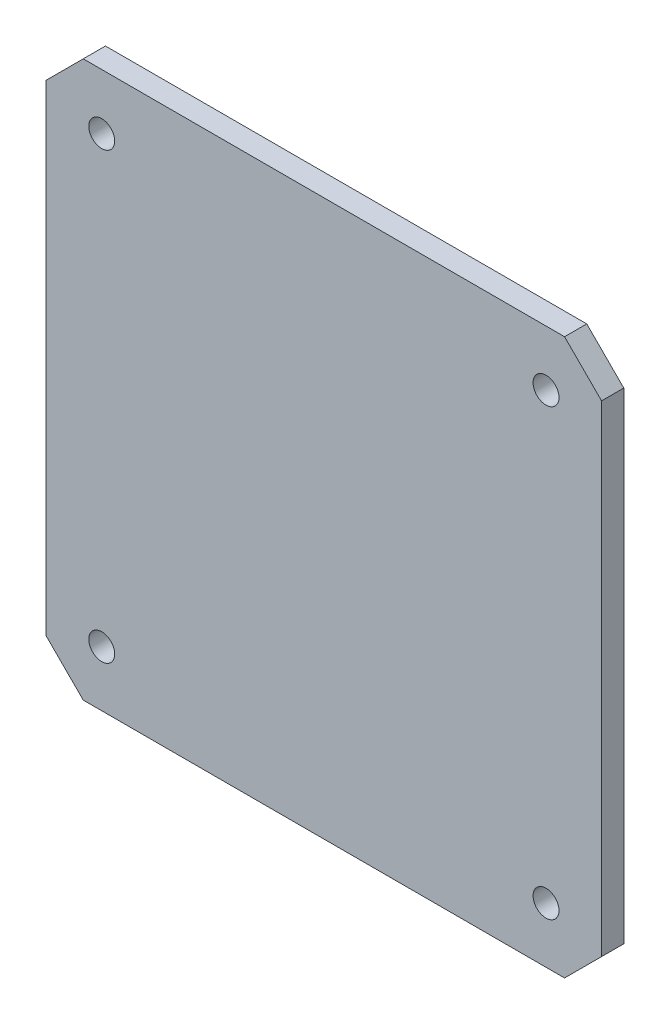
ISO-10303-21;
HEADER;
FILE_DESCRIPTION(('STEP AP214'),'2;1');
FILE_NAME('part.step','',(''),(''),'','','');
FILE_SCHEMA(('AUTOMOTIVE_DESIGN { 1 0 10303 214 1 1 1 1 }'));
ENDSEC;
DATA;
#1=APPLICATION_CONTEXT('core data for automotive mechanical design processes');
#2=APPLICATION_PROTOCOL_DEFINITION('international standard','automotive_design',2000,#1);
#3=PRODUCT_CONTEXT('',#1,'mechanical');
#4=PRODUCT('Part','Part','',(#3));
#5=PRODUCT_RELATED_PRODUCT_CATEGORY('part','',(#4));
#6=PRODUCT_DEFINITION_FORMATION('','',#4);
#7=PRODUCT_DEFINITION_CONTEXT('part definition',#1,'design');
#8=PRODUCT_DEFINITION('design','',#6,#7);
#9=PRODUCT_DEFINITION_SHAPE('','',#8);
#10=(LENGTH_UNIT() NAMED_UNIT(*) SI_UNIT(.MILLI.,.METRE.));
#11=(NAMED_UNIT(*) PLANE_ANGLE_UNIT() SI_UNIT($,.RADIAN.));
#12=(NAMED_UNIT(*) SI_UNIT($,.STERADIAN.) SOLID_ANGLE_UNIT());
#13=UNCERTAINTY_MEASURE_WITH_UNIT(LENGTH_MEASURE(1.E-05),#10,'distance_accuracy_value','');
#14=(GEOMETRIC_REPRESENTATION_CONTEXT(3) GLOBAL_UNCERTAINTY_ASSIGNED_CONTEXT((#13)) GLOBAL_UNIT_ASSIGNED_CONTEXT((#10,
#11,#12)) REPRESENTATION_CONTEXT('',''));
#15=CARTESIAN_POINT('',(0.,0.,0.));
#16=DIRECTION('',(0.,0.,1.));
#17=DIRECTION('',(1.,0.,0.));
#18=AXIS2_PLACEMENT_3D('',#15,#16,#17);
#19=CARTESIAN_POINT('',(-75.,75.,-6.));
#20=DIRECTION('',(-1.,0.,0.));
#21=DIRECTION('',(0.,-1.,0.));
#22=AXIS2_PLACEMENT_3D('',#19,#20,#21);
#23=PLANE('',#22);
#24=DIRECTION('',(0.,-1.,0.));
#25=VECTOR('',#24,1.);
#26=CARTESIAN_POINT('',(-75.,75.,-6.));
#27=LINE('',#26,#25);
#28=CARTESIAN_POINT('',(-75.,65.,-6.));
#29=VERTEX_POINT('',#28);
#30=CARTESIAN_POINT('',(-75.,-65.,-6.));
#31=VERTEX_POINT('',#30);
#32=EDGE_CURVE('E137',#29,#31,#27,.T.);
#33=ORIENTED_EDGE('',*,*,#32,.T.);
#34=DIRECTION('',(0.,0.,1.));
#35=VECTOR('',#34,1.);
#36=CARTESIAN_POINT('',(-75.,-65.,-6.));
#37=LINE('',#36,#35);
#38=CARTESIAN_POINT('',(-75.,-65.,0.));
#39=VERTEX_POINT('',#38);
#40=EDGE_CURVE('E179',#31,#39,#37,.T.);
#41=ORIENTED_EDGE('',*,*,#40,.T.);
#42=DIRECTION('',(0.,-1.,0.));
#43=VECTOR('',#42,1.);
#44=CARTESIAN_POINT('',(-75.,75.,0.));
#45=LINE('',#44,#43);
#46=CARTESIAN_POINT('',(-75.,65.,0.));
#47=VERTEX_POINT('',#46);
#48=EDGE_CURVE('E185',#47,#39,#45,.T.);
#49=ORIENTED_EDGE('',*,*,#48,.F.);
#50=DIRECTION('',(0.,0.,-1.));
#51=VECTOR('',#50,1.);
#52=CARTESIAN_POINT('',(-75.,65.,-6.));
#53=LINE('',#52,#51);
#54=EDGE_CURVE('E146',#47,#29,#53,.T.);
#55=ORIENTED_EDGE('',*,*,#54,.T.);
#56=EDGE_LOOP('',(#33,#41,#49,#55));
#57=FACE_BOUND('',#56,.T.);
#58=ADVANCED_FACE('F66',(#57),#23,.T.);
#59=CARTESIAN_POINT('',(75.,75.,-6.));
#60=DIRECTION('',(0.,1.,0.));
#61=DIRECTION('',(-1.,0.,0.));
#62=AXIS2_PLACEMENT_3D('',#59,#60,#61);
#63=PLANE('',#62);
#64=DIRECTION('',(-1.,0.,0.));
#65=VECTOR('',#64,1.);
#66=CARTESIAN_POINT('',(75.,75.,0.));
#67=LINE('',#66,#65);
#68=CARTESIAN_POINT('',(65.,75.,0.));
#69=VERTEX_POINT('',#68);
#70=CARTESIAN_POINT('',(-65.,75.,0.));
#71=VERTEX_POINT('',#70);
#72=EDGE_CURVE('E127',#69,#71,#67,.T.);
#73=ORIENTED_EDGE('',*,*,#72,.F.);
#74=DIRECTION('',(0.,0.,-1.));
#75=VECTOR('',#74,1.);
#76=CARTESIAN_POINT('',(65.,75.,-6.));
#77=LINE('',#76,#75);
#78=CARTESIAN_POINT('',(65.,75.,-6.));
#79=VERTEX_POINT('',#78);
#80=EDGE_CURVE('E164',#69,#79,#77,.T.);
#81=ORIENTED_EDGE('',*,*,#80,.T.);
#82=DIRECTION('',(-1.,0.,0.));
#83=VECTOR('',#82,1.);
#84=CARTESIAN_POINT('',(75.,75.,-6.));
#85=LINE('',#84,#83);
#86=CARTESIAN_POINT('',(-65.,75.,-6.));
#87=VERTEX_POINT('',#86);
#88=EDGE_CURVE('E150',#79,#87,#85,.T.);
#89=ORIENTED_EDGE('',*,*,#88,.T.);
#90=DIRECTION('',(0.,0.,1.));
#91=VECTOR('',#90,1.);
#92=CARTESIAN_POINT('',(-65.,75.,-6.));
#93=LINE('',#92,#91);
#94=EDGE_CURVE('E145',#87,#71,#93,.T.);
#95=ORIENTED_EDGE('',*,*,#94,.T.);
#96=EDGE_LOOP('',(#73,#81,#89,#95));
#97=FACE_BOUND('',#96,.T.);
#98=ADVANCED_FACE('F148',(#97),#63,.T.);
#99=CARTESIAN_POINT('',(75.,75.,-6.));
#100=DIRECTION('',(1.,0.,0.));
#101=DIRECTION('',(0.,1.,0.));
#102=AXIS2_PLACEMENT_3D('',#99,#100,#101);
#103=PLANE('',#102);
#104=DIRECTION('',(0.,1.,0.));
#105=VECTOR('',#104,1.);
#106=CARTESIAN_POINT('',(75.,75.,0.));
#107=LINE('',#106,#105);
#108=CARTESIAN_POINT('',(75.,-65.,0.));
#109=VERTEX_POINT('',#108);
#110=CARTESIAN_POINT('',(75.,65.,0.));
#111=VERTEX_POINT('',#110);
#112=EDGE_CURVE('E138',#109,#111,#107,.T.);
#113=ORIENTED_EDGE('',*,*,#112,.F.);
#114=DIRECTION('',(0.,0.,-1.));
#115=VECTOR('',#114,1.);
#116=CARTESIAN_POINT('',(75.,-65.,-6.));
#117=LINE('',#116,#115);
#118=CARTESIAN_POINT('',(75.,-65.,-6.));
#119=VERTEX_POINT('',#118);
#120=EDGE_CURVE('E174',#109,#119,#117,.T.);
#121=ORIENTED_EDGE('',*,*,#120,.T.);
#122=DIRECTION('',(0.,1.,0.));
#123=VECTOR('',#122,1.);
#124=CARTESIAN_POINT('',(75.,75.,-6.));
#125=LINE('',#124,#123);
#126=CARTESIAN_POINT('',(75.,65.,-6.));
#127=VERTEX_POINT('',#126);
#128=EDGE_CURVE('E153',#119,#127,#125,.T.);
#129=ORIENTED_EDGE('',*,*,#128,.T.);
#130=DIRECTION('',(0.,0.,1.));
#131=VECTOR('',#130,1.);
#132=CARTESIAN_POINT('',(75.,65.,-6.));
#133=LINE('',#132,#131);
#134=EDGE_CURVE('E160',#127,#111,#133,.T.);
#135=ORIENTED_EDGE('',*,*,#134,.T.);
#136=EDGE_LOOP('',(#113,#121,#129,#135));
#137=FACE_BOUND('',#136,.T.);
#138=ADVANCED_FACE('F205',(#137),#103,.T.);
#139=CARTESIAN_POINT('',(75.,-75.,-6.));
#140=DIRECTION('',(0.,-1.,0.));
#141=DIRECTION('',(1.,0.,0.));
#142=AXIS2_PLACEMENT_3D('',#139,#140,#141);
#143=PLANE('',#142);
#144=DIRECTION('',(1.,0.,0.));
#145=VECTOR('',#144,1.);
#146=CARTESIAN_POINT('',(75.,-75.,0.));
#147=LINE('',#146,#145);
#148=CARTESIAN_POINT('',(-65.,-75.,0.));
#149=VERTEX_POINT('',#148);
#150=CARTESIAN_POINT('',(65.,-75.,0.));
#151=VERTEX_POINT('',#150);
#152=EDGE_CURVE('E189',#149,#151,#147,.T.);
#153=ORIENTED_EDGE('',*,*,#152,.F.);
#154=DIRECTION('',(0.,0.,-1.));
#155=VECTOR('',#154,1.);
#156=CARTESIAN_POINT('',(-65.,-75.,-6.));
#157=LINE('',#156,#155);
#158=CARTESIAN_POINT('',(-65.,-75.,-6.));
#159=VERTEX_POINT('',#158);
#160=EDGE_CURVE('E74',#149,#159,#157,.T.);
#161=ORIENTED_EDGE('',*,*,#160,.T.);
#162=DIRECTION('',(1.,0.,0.));
#163=VECTOR('',#162,1.);
#164=CARTESIAN_POINT('',(75.,-75.,-6.));
#165=LINE('',#164,#163);
#166=CARTESIAN_POINT('',(65.,-75.,-6.));
#167=VERTEX_POINT('',#166);
#168=EDGE_CURVE('E209',#159,#167,#165,.T.);
#169=ORIENTED_EDGE('',*,*,#168,.T.);
#170=DIRECTION('',(0.,0.,1.));
#171=VECTOR('',#170,1.);
#172=CARTESIAN_POINT('',(65.,-75.,-6.));
#173=LINE('',#172,#171);
#174=EDGE_CURVE('E169',#167,#151,#173,.T.);
#175=ORIENTED_EDGE('',*,*,#174,.T.);
#176=EDGE_LOOP('',(#153,#161,#169,#175));
#177=FACE_BOUND('',#176,.T.);
#178=ADVANCED_FACE('F239',(#177),#143,.T.);
#179=CARTESIAN_POINT('',(0.,0.,-6.));
#180=DIRECTION('',(0.,0.,-1.));
#181=DIRECTION('',(-1.,0.,0.));
#182=AXIS2_PLACEMENT_3D('',#179,#180,#181);
#183=PLANE('',#182);
#184=CARTESIAN_POINT('',(60.,60.,-6.));
#185=DIRECTION('',(0.,0.,-1.));
#186=DIRECTION('',(-1.,0.,0.));
#187=AXIS2_PLACEMENT_3D('',#184,#185,#186);
#188=CIRCLE('',#187,3.49999999999999);
#189=CARTESIAN_POINT('',(56.5,60.,-6.));
#190=VERTEX_POINT('',#189);
#191=EDGE_CURVE('E231',#190,#190,#188,.T.);
#192=ORIENTED_EDGE('',*,*,#191,.F.);
#193=EDGE_LOOP('',(#192));
#194=FACE_BOUND('',#193,.T.);
#195=CARTESIAN_POINT('',(60.,-60.,-6.));
#196=DIRECTION('',(0.,0.,-1.));
#197=DIRECTION('',(-1.,0.,0.));
#198=AXIS2_PLACEMENT_3D('',#195,#196,#197);
#199=CIRCLE('',#198,3.49999999999999);
#200=CARTESIAN_POINT('',(56.5,-60.,-6.));
#201=VERTEX_POINT('',#200);
#202=EDGE_CURVE('E225',#201,#201,#199,.T.);
#203=ORIENTED_EDGE('',*,*,#202,.F.);
#204=EDGE_LOOP('',(#203));
#205=FACE_BOUND('',#204,.T.);
#206=CARTESIAN_POINT('',(-60.,-60.,-6.));
#207=DIRECTION('',(0.,0.,-1.));
#208=DIRECTION('',(-1.,0.,0.));
#209=AXIS2_PLACEMENT_3D('',#206,#207,#208);
#210=CIRCLE('',#209,3.49999999999999);
#211=CARTESIAN_POINT('',(-63.5,-60.,-6.));
#212=VERTEX_POINT('',#211);
#213=EDGE_CURVE('E219',#212,#212,#210,.T.);
#214=ORIENTED_EDGE('',*,*,#213,.F.);
#215=EDGE_LOOP('',(#214));
#216=FACE_BOUND('',#215,.T.);
#217=CARTESIAN_POINT('',(-60.,60.,-6.));
#218=DIRECTION('',(0.,0.,-1.));
#219=DIRECTION('',(-1.,0.,0.));
#220=AXIS2_PLACEMENT_3D('',#217,#218,#219);
#221=CIRCLE('',#220,3.49999999999999);
#222=CARTESIAN_POINT('',(-63.5,60.,-6.));
#223=VERTEX_POINT('',#222);
#224=EDGE_CURVE('E194',#223,#223,#221,.T.);
#225=ORIENTED_EDGE('',*,*,#224,.F.);
#226=EDGE_LOOP('',(#225));
#227=FACE_BOUND('',#226,.T.);
#228=ORIENTED_EDGE('',*,*,#168,.F.);
#229=DIRECTION('',(0.707106781186547,-0.707106781186548,0.));
#230=VECTOR('',#229,1.);
#231=CARTESIAN_POINT('',(-70.0000000000001,-70.,-6.));
#232=LINE('',#231,#230);
#233=EDGE_CURVE('E13',#159,#31,#232,.F.);
#234=ORIENTED_EDGE('',*,*,#233,.T.);
#235=ORIENTED_EDGE('',*,*,#32,.F.);
#236=DIRECTION('',(-0.707106781186547,-0.707106781186548,0.));
#237=VECTOR('',#236,1.);
#238=CARTESIAN_POINT('',(-70.0000000000001,70.,-6.));
#239=LINE('',#238,#237);
#240=EDGE_CURVE('E158',#29,#87,#239,.F.);
#241=ORIENTED_EDGE('',*,*,#240,.T.);
#242=ORIENTED_EDGE('',*,*,#88,.F.);
#243=DIRECTION('',(-0.707106781186548,0.707106781186548,0.));
#244=VECTOR('',#243,1.);
#245=CARTESIAN_POINT('',(70.,70.,-6.));
#246=LINE('',#245,#244);
#247=EDGE_CURVE('E166',#79,#127,#246,.F.);
#248=ORIENTED_EDGE('',*,*,#247,.T.);
#249=ORIENTED_EDGE('',*,*,#128,.F.);
#250=DIRECTION('',(0.707106781186548,0.707106781186548,0.));
#251=VECTOR('',#250,1.);
#252=CARTESIAN_POINT('',(70.,-70.,-6.));
#253=LINE('',#252,#251);
#254=EDGE_CURVE('E176',#119,#167,#253,.F.);
#255=ORIENTED_EDGE('',*,*,#254,.T.);
#256=EDGE_LOOP('',(#228,#234,#235,#241,#242,#248,#249,#255));
#257=FACE_BOUND('',#256,.T.);
#258=ADVANCED_FACE('F210',(#194,#205,#216,#227,#257),#183,.T.);
#259=CARTESIAN_POINT('',(0.,0.,0.));
#260=DIRECTION('',(0.,0.,-1.));
#261=DIRECTION('',(-1.,0.,0.));
#262=AXIS2_PLACEMENT_3D('',#259,#260,#261);
#263=PLANE('',#262);
#264=CARTESIAN_POINT('',(60.,60.,0.));
#265=DIRECTION('',(0.,0.,-1.));
#266=DIRECTION('',(-1.,0.,0.));
#267=AXIS2_PLACEMENT_3D('',#264,#265,#266);
#268=CIRCLE('',#267,3.5);
#269=CARTESIAN_POINT('',(56.5,60.,0.));
#270=VERTEX_POINT('',#269);
#271=EDGE_CURVE('E228',#270,#270,#268,.T.);
#272=ORIENTED_EDGE('',*,*,#271,.T.);
#273=EDGE_LOOP('',(#272));
#274=FACE_BOUND('',#273,.T.);
#275=CARTESIAN_POINT('',(60.,-60.,0.));
#276=DIRECTION('',(0.,0.,-1.));
#277=DIRECTION('',(-1.,0.,0.));
#278=AXIS2_PLACEMENT_3D('',#275,#276,#277);
#279=CIRCLE('',#278,3.5);
#280=CARTESIAN_POINT('',(56.5,-60.,0.));
#281=VERTEX_POINT('',#280);
#282=EDGE_CURVE('E222',#281,#281,#279,.T.);
#283=ORIENTED_EDGE('',*,*,#282,.T.);
#284=EDGE_LOOP('',(#283));
#285=FACE_BOUND('',#284,.T.);
#286=CARTESIAN_POINT('',(-60.,-60.,0.));
#287=DIRECTION('',(0.,0.,-1.));
#288=DIRECTION('',(-1.,0.,0.));
#289=AXIS2_PLACEMENT_3D('',#286,#287,#288);
#290=CIRCLE('',#289,3.49999999999999);
#291=CARTESIAN_POINT('',(-63.5,-60.,0.));
#292=VERTEX_POINT('',#291);
#293=EDGE_CURVE('E216',#292,#292,#290,.T.);
#294=ORIENTED_EDGE('',*,*,#293,.T.);
#295=EDGE_LOOP('',(#294));
#296=FACE_BOUND('',#295,.T.);
#297=CARTESIAN_POINT('',(-60.,60.,0.));
#298=DIRECTION('',(0.,0.,-1.));
#299=DIRECTION('',(-1.,0.,0.));
#300=AXIS2_PLACEMENT_3D('',#297,#298,#299);
#301=CIRCLE('',#300,3.49999999999999);
#302=CARTESIAN_POINT('',(-63.5,60.,0.));
#303=VERTEX_POINT('',#302);
#304=EDGE_CURVE('E190',#303,#303,#301,.T.);
#305=ORIENTED_EDGE('',*,*,#304,.T.);
#306=EDGE_LOOP('',(#305));
#307=FACE_BOUND('',#306,.T.);
#308=ORIENTED_EDGE('',*,*,#48,.T.);
#309=DIRECTION('',(-0.707106781186547,0.707106781186548,0.));
#310=VECTOR('',#309,1.);
#311=CARTESIAN_POINT('',(-75.,-65.,0.));
#312=LINE('',#311,#310);
#313=EDGE_CURVE('E88',#39,#149,#312,.F.);
#314=ORIENTED_EDGE('',*,*,#313,.T.);
#315=ORIENTED_EDGE('',*,*,#152,.T.);
#316=DIRECTION('',(-0.707106781186548,-0.707106781186548,0.));
#317=VECTOR('',#316,1.);
#318=CARTESIAN_POINT('',(65.,-75.,0.));
#319=LINE('',#318,#317);
#320=EDGE_CURVE('E172',#151,#109,#319,.F.);
#321=ORIENTED_EDGE('',*,*,#320,.T.);
#322=ORIENTED_EDGE('',*,*,#112,.T.);
#323=DIRECTION('',(0.707106781186548,-0.707106781186548,0.));
#324=VECTOR('',#323,1.);
#325=CARTESIAN_POINT('',(75.,65.,0.));
#326=LINE('',#325,#324);
#327=EDGE_CURVE('E133',#111,#69,#326,.F.);
#328=ORIENTED_EDGE('',*,*,#327,.T.);
#329=ORIENTED_EDGE('',*,*,#72,.T.);
#330=DIRECTION('',(0.707106781186547,0.707106781186548,0.));
#331=VECTOR('',#330,1.);
#332=CARTESIAN_POINT('',(-65.,75.,0.));
#333=LINE('',#332,#331);
#334=EDGE_CURVE('E130',#71,#47,#333,.F.);
#335=ORIENTED_EDGE('',*,*,#334,.T.);
#336=EDGE_LOOP('',(#308,#314,#315,#321,#322,#328,#329,#335));
#337=FACE_BOUND('',#336,.T.);
#338=ADVANCED_FACE('F129',(#274,#285,#296,#307,#337),#263,.F.);
#339=CARTESIAN_POINT('',(-65.,75.,-6.));
#340=DIRECTION('',(0.707106781186548,-0.707106781186547,0.));
#341=DIRECTION('',(0.,0.,1.));
#342=AXIS2_PLACEMENT_3D('',#339,#340,#341);
#343=PLANE('',#342);
#344=ORIENTED_EDGE('',*,*,#240,.F.);
#345=ORIENTED_EDGE('',*,*,#54,.F.);
#346=ORIENTED_EDGE('',*,*,#334,.F.);
#347=ORIENTED_EDGE('',*,*,#94,.F.);
#348=EDGE_LOOP('',(#344,#345,#346,#347));
#349=FACE_BOUND('',#348,.T.);
#350=ADVANCED_FACE('F144',(#349),#343,.F.);
#351=CARTESIAN_POINT('',(75.,65.,-6.));
#352=DIRECTION('',(-0.707106781186547,-0.707106781186547,0.));
#353=DIRECTION('',(0.,0.,1.));
#354=AXIS2_PLACEMENT_3D('',#351,#352,#353);
#355=PLANE('',#354);
#356=ORIENTED_EDGE('',*,*,#247,.F.);
#357=ORIENTED_EDGE('',*,*,#80,.F.);
#358=ORIENTED_EDGE('',*,*,#327,.F.);
#359=ORIENTED_EDGE('',*,*,#134,.F.);
#360=EDGE_LOOP('',(#356,#357,#358,#359));
#361=FACE_BOUND('',#360,.T.);
#362=ADVANCED_FACE('F204',(#361),#355,.F.);
#363=CARTESIAN_POINT('',(65.,-75.,-6.));
#364=DIRECTION('',(-0.707106781186547,0.707106781186547,0.));
#365=DIRECTION('',(0.,0.,1.));
#366=AXIS2_PLACEMENT_3D('',#363,#364,#365);
#367=PLANE('',#366);
#368=ORIENTED_EDGE('',*,*,#254,.F.);
#369=ORIENTED_EDGE('',*,*,#120,.F.);
#370=ORIENTED_EDGE('',*,*,#320,.F.);
#371=ORIENTED_EDGE('',*,*,#174,.F.);
#372=EDGE_LOOP('',(#368,#369,#370,#371));
#373=FACE_BOUND('',#372,.T.);
#374=ADVANCED_FACE('F259',(#373),#367,.F.);
#375=CARTESIAN_POINT('',(-75.,-65.,-6.));
#376=DIRECTION('',(0.707106781186548,0.707106781186547,0.));
#377=DIRECTION('',(0.,0.,1.));
#378=AXIS2_PLACEMENT_3D('',#375,#376,#377);
#379=PLANE('',#378);
#380=ORIENTED_EDGE('',*,*,#233,.F.);
#381=ORIENTED_EDGE('',*,*,#160,.F.);
#382=ORIENTED_EDGE('',*,*,#313,.F.);
#383=ORIENTED_EDGE('',*,*,#40,.F.);
#384=EDGE_LOOP('',(#380,#381,#382,#383));
#385=FACE_BOUND('',#384,.T.);
#386=ADVANCED_FACE('F68',(#385),#379,.F.);
#387=CARTESIAN_POINT('',(-60.,60.,-6.));
#388=DIRECTION('',(0.,0.,-1.));
#389=DIRECTION('',(-1.,0.,0.));
#390=AXIS2_PLACEMENT_3D('',#387,#388,#389);
#391=CYLINDRICAL_SURFACE('',#390,3.49999999999999);
#392=ORIENTED_EDGE('',*,*,#304,.F.);
#393=EDGE_LOOP('',(#392));
#394=FACE_BOUND('',#393,.T.);
#395=ORIENTED_EDGE('',*,*,#224,.T.);
#396=EDGE_LOOP('',(#395));
#397=FACE_BOUND('',#396,.T.);
#398=ADVANCED_FACE('F247',(#394,#397),#391,.F.);
#399=CARTESIAN_POINT('',(-60.,-60.,-6.));
#400=DIRECTION('',(0.,0.,-1.));
#401=DIRECTION('',(-1.,0.,0.));
#402=AXIS2_PLACEMENT_3D('',#399,#400,#401);
#403=CYLINDRICAL_SURFACE('',#402,3.49999999999999);
#404=ORIENTED_EDGE('',*,*,#293,.F.);
#405=EDGE_LOOP('',(#404));
#406=FACE_BOUND('',#405,.T.);
#407=ORIENTED_EDGE('',*,*,#213,.T.);
#408=EDGE_LOOP('',(#407));
#409=FACE_BOUND('',#408,.T.);
#410=ADVANCED_FACE('F249',(#406,#409),#403,.F.);
#411=CARTESIAN_POINT('',(60.,-60.,-6.));
#412=DIRECTION('',(0.,0.,-1.));
#413=DIRECTION('',(-1.,0.,0.));
#414=AXIS2_PLACEMENT_3D('',#411,#412,#413);
#415=CYLINDRICAL_SURFACE('',#414,3.5);
#416=ORIENTED_EDGE('',*,*,#282,.F.);
#417=EDGE_LOOP('',(#416));
#418=FACE_BOUND('',#417,.T.);
#419=ORIENTED_EDGE('',*,*,#202,.T.);
#420=EDGE_LOOP('',(#419));
#421=FACE_BOUND('',#420,.T.);
#422=ADVANCED_FACE('F256',(#418,#421),#415,.F.);
#423=CARTESIAN_POINT('',(60.,60.,-6.));
#424=DIRECTION('',(0.,0.,-1.));
#425=DIRECTION('',(-1.,0.,0.));
#426=AXIS2_PLACEMENT_3D('',#423,#424,#425);
#427=CYLINDRICAL_SURFACE('',#426,3.5);
#428=ORIENTED_EDGE('',*,*,#271,.F.);
#429=EDGE_LOOP('',(#428));
#430=FACE_BOUND('',#429,.T.);
#431=ORIENTED_EDGE('',*,*,#191,.T.);
#432=EDGE_LOOP('',(#431));
#433=FACE_BOUND('',#432,.T.);
#434=ADVANCED_FACE('F235',(#430,#433),#427,.F.);
#435=CLOSED_SHELL('',(#58,#98,#138,#178,#258,#338,#350,#362,#374,#386,#398,#410,#422,#434));
#436=MANIFOLD_SOLID_BREP('B2',#435);
#437=ADVANCED_BREP_SHAPE_REPRESENTATION('',(#18,#436),#14);
#438=SHAPE_DEFINITION_REPRESENTATION(#9,#437);
ENDSEC;
END-ISO-10303-21;
